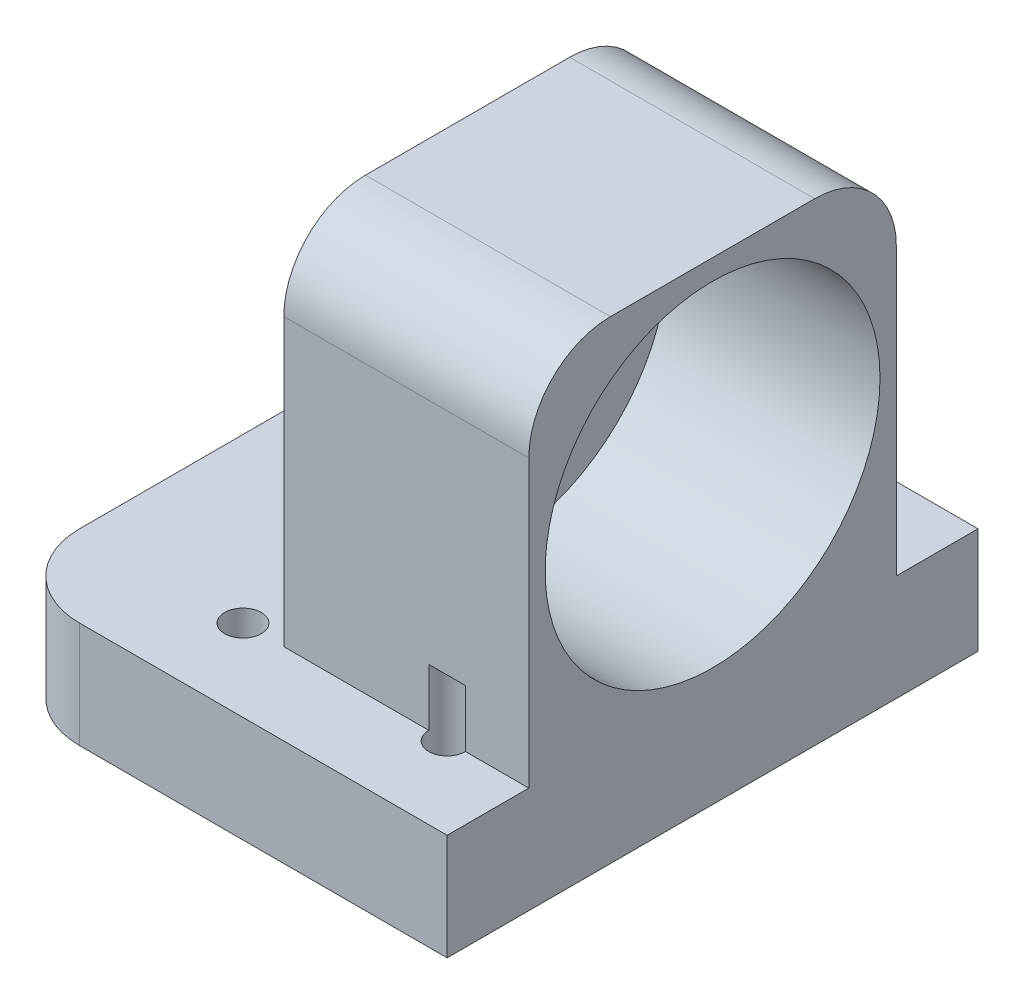
ISO-10303-21;
HEADER;
FILE_DESCRIPTION(('STEP AP214'),'2;1');
FILE_NAME('part.step','',(''),(''),'','','');
FILE_SCHEMA(('AUTOMOTIVE_DESIGN { 1 0 10303 214 1 1 1 1 }'));
ENDSEC;
DATA;
#1=APPLICATION_CONTEXT('core data for automotive mechanical design processes');
#2=APPLICATION_PROTOCOL_DEFINITION('international standard','automotive_design',2000,#1);
#3=PRODUCT_CONTEXT('',#1,'mechanical');
#4=PRODUCT('Part','Part','',(#3));
#5=PRODUCT_RELATED_PRODUCT_CATEGORY('part','',(#4));
#6=PRODUCT_DEFINITION_FORMATION('','',#4);
#7=PRODUCT_DEFINITION_CONTEXT('part definition',#1,'design');
#8=PRODUCT_DEFINITION('design','',#6,#7);
#9=PRODUCT_DEFINITION_SHAPE('','',#8);
#10=(LENGTH_UNIT() NAMED_UNIT(*) SI_UNIT(.MILLI.,.METRE.));
#11=(NAMED_UNIT(*) PLANE_ANGLE_UNIT() SI_UNIT($,.RADIAN.));
#12=(NAMED_UNIT(*) SI_UNIT($,.STERADIAN.) SOLID_ANGLE_UNIT());
#13=UNCERTAINTY_MEASURE_WITH_UNIT(LENGTH_MEASURE(1.E-05),#10,'distance_accuracy_value','');
#14=(GEOMETRIC_REPRESENTATION_CONTEXT(3) GLOBAL_UNCERTAINTY_ASSIGNED_CONTEXT((#13)) GLOBAL_UNIT_ASSIGNED_CONTEXT((#10,
#11,#12)) REPRESENTATION_CONTEXT('',''));
#15=CARTESIAN_POINT('',(0.,0.,0.));
#16=DIRECTION('',(0.,0.,1.));
#17=DIRECTION('',(1.,0.,0.));
#18=AXIS2_PLACEMENT_3D('',#15,#16,#17);
#19=CARTESIAN_POINT('',(22.5,13.,-32.5));
#20=DIRECTION('',(-1.,0.,0.));
#21=DIRECTION('',(0.,0.,1.));
#22=AXIS2_PLACEMENT_3D('',#19,#20,#21);
#23=PLANE('',#22);
#24=CARTESIAN_POINT('',(22.5,35.,0.));
#25=DIRECTION('',(1.,0.,0.));
#26=DIRECTION('',(0.,0.,-1.));
#27=AXIS2_PLACEMENT_3D('',#24,#25,#26);
#28=CIRCLE('',#27,20.5);
#29=CARTESIAN_POINT('',(22.5,35.,-20.5));
#30=VERTEX_POINT('',#29);
#31=EDGE_CURVE('E284',#30,#30,#28,.T.);
#32=ORIENTED_EDGE('',*,*,#31,.F.);
#33=EDGE_LOOP('',(#32));
#34=FACE_BOUND('',#33,.T.);
#35=DIRECTION('',(0.,-1.,0.));
#36=VECTOR('',#35,1.);
#37=CARTESIAN_POINT('',(22.5,63.,-22.5));
#38=LINE('',#37,#36);
#39=CARTESIAN_POINT('',(22.5,48.,-22.5));
#40=VERTEX_POINT('',#39);
#41=CARTESIAN_POINT('',(22.5,13.,-22.5));
#42=VERTEX_POINT('',#41);
#43=EDGE_CURVE('E308',#40,#42,#38,.T.);
#44=ORIENTED_EDGE('',*,*,#43,.F.);
#45=CARTESIAN_POINT('',(22.5,48.,-12.5));
#46=DIRECTION('',(-1.,0.,0.));
#47=DIRECTION('',(0.,0.,1.));
#48=AXIS2_PLACEMENT_3D('',#45,#46,#47);
#49=CIRCLE('',#48,10.);
#50=CARTESIAN_POINT('',(22.5,58.,-12.5));
#51=VERTEX_POINT('',#50);
#52=EDGE_CURVE('E11',#40,#51,#49,.F.);
#53=ORIENTED_EDGE('',*,*,#52,.T.);
#54=DIRECTION('',(0.,0.,-1.));
#55=VECTOR('',#54,1.);
#56=CARTESIAN_POINT('',(22.5,58.,-22.5));
#57=LINE('',#56,#55);
#58=CARTESIAN_POINT('',(22.5,58.,12.5));
#59=VERTEX_POINT('',#58);
#60=EDGE_CURVE('E168',#59,#51,#57,.T.);
#61=ORIENTED_EDGE('',*,*,#60,.F.);
#62=CARTESIAN_POINT('',(22.5,48.,12.5));
#63=DIRECTION('',(-1.,0.,0.));
#64=DIRECTION('',(0.,0.,1.));
#65=AXIS2_PLACEMENT_3D('',#62,#63,#64);
#66=CIRCLE('',#65,10.);
#67=CARTESIAN_POINT('',(22.5,48.,22.5));
#68=VERTEX_POINT('',#67);
#69=EDGE_CURVE('E209',#59,#68,#66,.F.);
#70=ORIENTED_EDGE('',*,*,#69,.T.);
#71=DIRECTION('',(0.,-1.,0.));
#72=VECTOR('',#71,1.);
#73=CARTESIAN_POINT('',(22.5,63.,22.5));
#74=LINE('',#73,#72);
#75=CARTESIAN_POINT('',(22.5,13.,22.5));
#76=VERTEX_POINT('',#75);
#77=EDGE_CURVE('E299',#68,#76,#74,.T.);
#78=ORIENTED_EDGE('',*,*,#77,.T.);
#79=DIRECTION('',(0.,0.,-1.));
#80=VECTOR('',#79,1.);
#81=CARTESIAN_POINT('',(22.5,13.,-32.5));
#82=LINE('',#81,#80);
#83=CARTESIAN_POINT('',(22.5,13.,32.5));
#84=VERTEX_POINT('',#83);
#85=EDGE_CURVE('E321',#84,#76,#82,.T.);
#86=ORIENTED_EDGE('',*,*,#85,.F.);
#87=DIRECTION('',(0.,-1.,0.));
#88=VECTOR('',#87,1.);
#89=CARTESIAN_POINT('',(22.5,13.,32.5));
#90=LINE('',#89,#88);
#91=CARTESIAN_POINT('',(22.5,0.,32.5));
#92=VERTEX_POINT('',#91);
#93=EDGE_CURVE('E160',#84,#92,#90,.T.);
#94=ORIENTED_EDGE('',*,*,#93,.T.);
#95=DIRECTION('',(0.,0.,-1.));
#96=VECTOR('',#95,1.);
#97=CARTESIAN_POINT('',(22.5,0.,-32.5));
#98=LINE('',#97,#96);
#99=CARTESIAN_POINT('',(22.5,0.,-32.5));
#100=VERTEX_POINT('',#99);
#101=EDGE_CURVE('E335',#92,#100,#98,.T.);
#102=ORIENTED_EDGE('',*,*,#101,.T.);
#103=DIRECTION('',(0.,-1.,0.));
#104=VECTOR('',#103,1.);
#105=CARTESIAN_POINT('',(22.5,13.,-32.5));
#106=LINE('',#105,#104);
#107=CARTESIAN_POINT('',(22.5,13.,-32.5));
#108=VERTEX_POINT('',#107);
#109=EDGE_CURVE('E343',#108,#100,#106,.T.);
#110=ORIENTED_EDGE('',*,*,#109,.F.);
#111=EDGE_CURVE('E320',#42,#108,#82,.T.);
#112=ORIENTED_EDGE('',*,*,#111,.F.);
#113=EDGE_LOOP('',(#44,#53,#61,#70,#78,#86,#94,#102,#110,#112));
#114=FACE_BOUND('',#113,.T.);
#115=ADVANCED_FACE('F45',(#34,#114),#23,.F.);
#116=CARTESIAN_POINT('',(22.5,63.,-22.5));
#117=DIRECTION('',(0.,0.,1.));
#118=DIRECTION('',(1.,0.,0.));
#119=AXIS2_PLACEMENT_3D('',#116,#117,#118);
#120=PLANE('',#119);
#121=DIRECTION('',(0.,-1.,0.));
#122=VECTOR('',#121,1.);
#123=CARTESIAN_POINT('',(-7.5,63.,-22.5));
#124=LINE('',#123,#122);
#125=CARTESIAN_POINT('',(-7.5,48.,-22.5));
#126=VERTEX_POINT('',#125);
#127=CARTESIAN_POINT('',(-7.5,13.,-22.5));
#128=VERTEX_POINT('',#127);
#129=EDGE_CURVE('E305',#126,#128,#124,.T.);
#130=ORIENTED_EDGE('',*,*,#129,.F.);
#131=DIRECTION('',(-1.,0.,0.));
#132=VECTOR('',#131,1.);
#133=CARTESIAN_POINT('',(22.5,48.,-22.5));
#134=LINE('',#133,#132);
#135=EDGE_CURVE('E54',#126,#40,#134,.F.);
#136=ORIENTED_EDGE('',*,*,#135,.T.);
#137=ORIENTED_EDGE('',*,*,#43,.T.);
#138=DIRECTION('',(-1.,0.,0.));
#139=VECTOR('',#138,1.);
#140=CARTESIAN_POINT('',(22.5,13.,-22.5));
#141=LINE('',#140,#139);
#142=CARTESIAN_POINT('',(14.75,13.,-22.5));
#143=VERTEX_POINT('',#142);
#144=EDGE_CURVE('E288',#42,#143,#141,.T.);
#145=ORIENTED_EDGE('',*,*,#144,.T.);
#146=DIRECTION('',(0.,-1.,0.));
#147=VECTOR('',#146,1.);
#148=CARTESIAN_POINT('',(14.75,20.,-22.5));
#149=LINE('',#148,#147);
#150=CARTESIAN_POINT('',(14.75,20.,-22.5));
#151=VERTEX_POINT('',#150);
#152=EDGE_CURVE('E184',#143,#151,#149,.F.);
#153=ORIENTED_EDGE('',*,*,#152,.T.);
#154=DIRECTION('',(1.,0.,0.));
#155=VECTOR('',#154,1.);
#156=CARTESIAN_POINT('',(22.5,20.,-22.5));
#157=LINE('',#156,#155);
#158=CARTESIAN_POINT('',(10.25,20.,-22.5));
#159=VERTEX_POINT('',#158);
#160=EDGE_CURVE('E178',#159,#151,#157,.T.);
#161=ORIENTED_EDGE('',*,*,#160,.F.);
#162=DIRECTION('',(0.,-1.,0.));
#163=VECTOR('',#162,1.);
#164=CARTESIAN_POINT('',(10.25,20.,-22.5));
#165=LINE('',#164,#163);
#166=CARTESIAN_POINT('',(10.25,13.,-22.5));
#167=VERTEX_POINT('',#166);
#168=EDGE_CURVE('E188',#159,#167,#165,.T.);
#169=ORIENTED_EDGE('',*,*,#168,.T.);
#170=EDGE_CURVE('E283',#167,#128,#141,.T.);
#171=ORIENTED_EDGE('',*,*,#170,.T.);
#172=EDGE_LOOP('',(#130,#136,#137,#145,#153,#161,#169,#171));
#173=FACE_BOUND('',#172,.T.);
#174=ADVANCED_FACE('F370',(#173),#120,.F.);
#175=CARTESIAN_POINT('',(-7.5,63.,-22.5));
#176=DIRECTION('',(1.,0.,0.));
#177=DIRECTION('',(0.,0.,-1.));
#178=AXIS2_PLACEMENT_3D('',#175,#176,#177);
#179=PLANE('',#178);
#180=CARTESIAN_POINT('',(-7.5,35.,0.));
#181=DIRECTION('',(1.,0.,0.));
#182=DIRECTION('',(0.,0.,-1.));
#183=AXIS2_PLACEMENT_3D('',#180,#181,#182);
#184=CIRCLE('',#183,7.);
#185=CARTESIAN_POINT('',(-7.5,35.,-7.));
#186=VERTEX_POINT('',#185);
#187=EDGE_CURVE('E278',#186,#186,#184,.T.);
#188=ORIENTED_EDGE('',*,*,#187,.T.);
#189=EDGE_LOOP('',(#188));
#190=FACE_BOUND('',#189,.T.);
#191=DIRECTION('',(0.,0.,1.));
#192=VECTOR('',#191,1.);
#193=CARTESIAN_POINT('',(-7.5,58.,-22.5));
#194=LINE('',#193,#192);
#195=CARTESIAN_POINT('',(-7.5,58.,-12.5));
#196=VERTEX_POINT('',#195);
#197=CARTESIAN_POINT('',(-7.5,58.,12.5));
#198=VERTEX_POINT('',#197);
#199=EDGE_CURVE('E229',#196,#198,#194,.T.);
#200=ORIENTED_EDGE('',*,*,#199,.F.);
#201=CARTESIAN_POINT('',(-7.5,48.,-12.5));
#202=DIRECTION('',(1.,0.,0.));
#203=DIRECTION('',(0.,0.,-1.));
#204=AXIS2_PLACEMENT_3D('',#201,#202,#203);
#205=CIRCLE('',#204,10.);
#206=EDGE_CURVE('E68',#196,#126,#205,.F.);
#207=ORIENTED_EDGE('',*,*,#206,.T.);
#208=ORIENTED_EDGE('',*,*,#129,.T.);
#209=DIRECTION('',(0.,0.,1.));
#210=VECTOR('',#209,1.);
#211=CARTESIAN_POINT('',(-7.5,13.,-22.5));
#212=LINE('',#211,#210);
#213=CARTESIAN_POINT('',(-7.49999999999999,13.,22.5));
#214=VERTEX_POINT('',#213);
#215=EDGE_CURVE('E292',#128,#214,#212,.T.);
#216=ORIENTED_EDGE('',*,*,#215,.T.);
#217=DIRECTION('',(0.,-1.,0.));
#218=VECTOR('',#217,1.);
#219=CARTESIAN_POINT('',(-7.49999999999999,63.,22.5));
#220=LINE('',#219,#218);
#221=CARTESIAN_POINT('',(-7.49999999999999,48.,22.5));
#222=VERTEX_POINT('',#221);
#223=EDGE_CURVE('E302',#222,#214,#220,.T.);
#224=ORIENTED_EDGE('',*,*,#223,.F.);
#225=CARTESIAN_POINT('',(-7.49999999999999,48.,12.5));
#226=DIRECTION('',(1.,0.,0.));
#227=DIRECTION('',(0.,0.,-1.));
#228=AXIS2_PLACEMENT_3D('',#225,#226,#227);
#229=CIRCLE('',#228,10.);
#230=EDGE_CURVE('E215',#222,#198,#229,.F.);
#231=ORIENTED_EDGE('',*,*,#230,.T.);
#232=EDGE_LOOP('',(#200,#207,#208,#216,#224,#231));
#233=FACE_BOUND('',#232,.T.);
#234=ADVANCED_FACE('F233',(#190,#233),#179,.F.);
#235=CARTESIAN_POINT('',(22.5,63.,22.5));
#236=DIRECTION('',(0.,0.,-1.));
#237=DIRECTION('',(-1.,0.,0.));
#238=AXIS2_PLACEMENT_3D('',#235,#236,#237);
#239=PLANE('',#238);
#240=ORIENTED_EDGE('',*,*,#77,.F.);
#241=DIRECTION('',(1.,0.,0.));
#242=VECTOR('',#241,1.);
#243=CARTESIAN_POINT('',(-7.49999999999999,48.,22.5));
#244=LINE('',#243,#242);
#245=EDGE_CURVE('E212',#68,#222,#244,.F.);
#246=ORIENTED_EDGE('',*,*,#245,.T.);
#247=ORIENTED_EDGE('',*,*,#223,.T.);
#248=DIRECTION('',(1.,0.,0.));
#249=VECTOR('',#248,1.);
#250=CARTESIAN_POINT('',(22.5,13.,22.5));
#251=LINE('',#250,#249);
#252=CARTESIAN_POINT('',(10.25,13.,22.5));
#253=VERTEX_POINT('',#252);
#254=EDGE_CURVE('E174',#214,#253,#251,.T.);
#255=ORIENTED_EDGE('',*,*,#254,.T.);
#256=DIRECTION('',(0.,-1.,0.));
#257=VECTOR('',#256,1.);
#258=CARTESIAN_POINT('',(10.25,20.,22.5));
#259=LINE('',#258,#257);
#260=CARTESIAN_POINT('',(10.25,20.,22.5));
#261=VERTEX_POINT('',#260);
#262=EDGE_CURVE('E159',#253,#261,#259,.F.);
#263=ORIENTED_EDGE('',*,*,#262,.T.);
#264=DIRECTION('',(-1.,0.,0.));
#265=VECTOR('',#264,1.);
#266=CARTESIAN_POINT('',(22.5,20.,22.5));
#267=LINE('',#266,#265);
#268=CARTESIAN_POINT('',(14.75,20.,22.5));
#269=VERTEX_POINT('',#268);
#270=EDGE_CURVE('E150',#269,#261,#267,.T.);
#271=ORIENTED_EDGE('',*,*,#270,.F.);
#272=DIRECTION('',(0.,-1.,0.));
#273=VECTOR('',#272,1.);
#274=CARTESIAN_POINT('',(14.75,20.,22.5));
#275=LINE('',#274,#273);
#276=CARTESIAN_POINT('',(14.75,13.,22.5));
#277=VERTEX_POINT('',#276);
#278=EDGE_CURVE('E165',#269,#277,#275,.T.);
#279=ORIENTED_EDGE('',*,*,#278,.T.);
#280=EDGE_CURVE('E296',#277,#76,#251,.T.);
#281=ORIENTED_EDGE('',*,*,#280,.T.);
#282=EDGE_LOOP('',(#240,#246,#247,#255,#263,#271,#279,#281));
#283=FACE_BOUND('',#282,.T.);
#284=ADVANCED_FACE('F172',(#283),#239,.F.);
#285=CARTESIAN_POINT('',(-32.5,13.,-32.5));
#286=DIRECTION('',(1.,0.,0.));
#287=DIRECTION('',(0.,0.,-1.));
#288=AXIS2_PLACEMENT_3D('',#285,#286,#287);
#289=PLANE('',#288);
#290=DIRECTION('',(0.,0.,1.));
#291=VECTOR('',#290,1.);
#292=CARTESIAN_POINT('',(-32.5,0.,-32.5));
#293=LINE('',#292,#291);
#294=CARTESIAN_POINT('',(-32.5,0.,-32.5));
#295=VERTEX_POINT('',#294);
#296=CARTESIAN_POINT('',(-32.5,0.,22.5));
#297=VERTEX_POINT('',#296);
#298=EDGE_CURVE('E311',#295,#297,#293,.T.);
#299=ORIENTED_EDGE('',*,*,#298,.T.);
#300=DIRECTION('',(0.,-1.,0.));
#301=VECTOR('',#300,1.);
#302=CARTESIAN_POINT('',(-32.5,13.,22.5));
#303=LINE('',#302,#301);
#304=CARTESIAN_POINT('',(-32.5,13.,22.5));
#305=VERTEX_POINT('',#304);
#306=EDGE_CURVE('E199',#297,#305,#303,.F.);
#307=ORIENTED_EDGE('',*,*,#306,.T.);
#308=DIRECTION('',(0.,0.,1.));
#309=VECTOR('',#308,1.);
#310=CARTESIAN_POINT('',(-32.5,13.,-32.5));
#311=LINE('',#310,#309);
#312=CARTESIAN_POINT('',(-32.5,13.,-32.5));
#313=VERTEX_POINT('',#312);
#314=EDGE_CURVE('E312',#313,#305,#311,.T.);
#315=ORIENTED_EDGE('',*,*,#314,.F.);
#316=DIRECTION('',(0.,-1.,0.));
#317=VECTOR('',#316,1.);
#318=CARTESIAN_POINT('',(-32.5,13.,-32.5));
#319=LINE('',#318,#317);
#320=EDGE_CURVE('E328',#313,#295,#319,.T.);
#321=ORIENTED_EDGE('',*,*,#320,.T.);
#322=EDGE_LOOP('',(#299,#307,#315,#321));
#323=FACE_BOUND('',#322,.T.);
#324=ADVANCED_FACE('F387',(#323),#289,.F.);
#325=CARTESIAN_POINT('',(-32.5,13.,32.5));
#326=DIRECTION('',(0.,0.,-1.));
#327=DIRECTION('',(-1.,0.,0.));
#328=AXIS2_PLACEMENT_3D('',#325,#326,#327);
#329=PLANE('',#328);
#330=DIRECTION('',(1.,0.,0.));
#331=VECTOR('',#330,1.);
#332=CARTESIAN_POINT('',(-32.5,13.,32.5));
#333=LINE('',#332,#331);
#334=CARTESIAN_POINT('',(-22.5,13.,32.5));
#335=VERTEX_POINT('',#334);
#336=EDGE_CURVE('E316',#335,#84,#333,.T.);
#337=ORIENTED_EDGE('',*,*,#336,.F.);
#338=DIRECTION('',(0.,-1.,0.));
#339=VECTOR('',#338,1.);
#340=CARTESIAN_POINT('',(-22.5,13.,32.5));
#341=LINE('',#340,#339);
#342=CARTESIAN_POINT('',(-22.5,0.,32.5));
#343=VERTEX_POINT('',#342);
#344=EDGE_CURVE('E192',#335,#343,#341,.T.);
#345=ORIENTED_EDGE('',*,*,#344,.T.);
#346=DIRECTION('',(1.,0.,0.));
#347=VECTOR('',#346,1.);
#348=CARTESIAN_POINT('',(-32.5,0.,32.5));
#349=LINE('',#348,#347);
#350=EDGE_CURVE('E332',#343,#92,#349,.T.);
#351=ORIENTED_EDGE('',*,*,#350,.T.);
#352=ORIENTED_EDGE('',*,*,#93,.F.);
#353=EDGE_LOOP('',(#337,#345,#351,#352));
#354=FACE_BOUND('',#353,.T.);
#355=ADVANCED_FACE('F384',(#354),#329,.F.);
#356=CARTESIAN_POINT('',(-32.5,13.,-32.5));
#357=DIRECTION('',(0.,0.,1.));
#358=DIRECTION('',(1.,0.,0.));
#359=AXIS2_PLACEMENT_3D('',#356,#357,#358);
#360=PLANE('',#359);
#361=DIRECTION('',(-1.,0.,0.));
#362=VECTOR('',#361,1.);
#363=CARTESIAN_POINT('',(-32.5,0.,-32.5));
#364=LINE('',#363,#362);
#365=EDGE_CURVE('E317',#100,#295,#364,.T.);
#366=ORIENTED_EDGE('',*,*,#365,.T.);
#367=ORIENTED_EDGE('',*,*,#320,.F.);
#368=DIRECTION('',(-1.,0.,0.));
#369=VECTOR('',#368,1.);
#370=CARTESIAN_POINT('',(-32.5,13.,-32.5));
#371=LINE('',#370,#369);
#372=EDGE_CURVE('E325',#108,#313,#371,.T.);
#373=ORIENTED_EDGE('',*,*,#372,.F.);
#374=ORIENTED_EDGE('',*,*,#109,.T.);
#375=EDGE_LOOP('',(#366,#367,#373,#374));
#376=FACE_BOUND('',#375,.T.);
#377=ADVANCED_FACE('F382',(#376),#360,.F.);
#378=CARTESIAN_POINT('',(0.,13.,0.));
#379=DIRECTION('',(0.,1.,0.));
#380=DIRECTION('',(0.,0.,1.));
#381=AXIS2_PLACEMENT_3D('',#378,#379,#380);
#382=PLANE('',#381);
#383=ORIENTED_EDGE('',*,*,#314,.T.);
#384=CARTESIAN_POINT('',(-22.5,13.,22.5));
#385=DIRECTION('',(0.,1.,0.));
#386=DIRECTION('',(0.,0.,1.));
#387=AXIS2_PLACEMENT_3D('',#384,#385,#386);
#388=CIRCLE('',#387,10.);
#389=EDGE_CURVE('E202',#305,#335,#388,.T.);
#390=ORIENTED_EDGE('',*,*,#389,.T.);
#391=ORIENTED_EDGE('',*,*,#336,.T.);
#392=ORIENTED_EDGE('',*,*,#85,.T.);
#393=ORIENTED_EDGE('',*,*,#280,.F.);
#394=CARTESIAN_POINT('',(12.5,13.,22.5));
#395=DIRECTION('',(0.,1.,0.));
#396=DIRECTION('',(0.,0.,1.));
#397=AXIS2_PLACEMENT_3D('',#394,#395,#396);
#398=CIRCLE('',#397,2.25);
#399=EDGE_CURVE('E260',#253,#277,#398,.T.);
#400=ORIENTED_EDGE('',*,*,#399,.F.);
#401=ORIENTED_EDGE('',*,*,#254,.F.);
#402=ORIENTED_EDGE('',*,*,#215,.F.);
#403=ORIENTED_EDGE('',*,*,#170,.F.);
#404=CARTESIAN_POINT('',(12.5,13.,-22.5));
#405=DIRECTION('',(0.,1.,0.));
#406=DIRECTION('',(0.,0.,1.));
#407=AXIS2_PLACEMENT_3D('',#404,#405,#406);
#408=CIRCLE('',#407,2.25);
#409=EDGE_CURVE('E263',#143,#167,#408,.T.);
#410=ORIENTED_EDGE('',*,*,#409,.F.);
#411=ORIENTED_EDGE('',*,*,#144,.F.);
#412=ORIENTED_EDGE('',*,*,#111,.T.);
#413=ORIENTED_EDGE('',*,*,#372,.T.);
#414=EDGE_LOOP('',(#383,#390,#391,#392,#393,#400,#401,#402,#403,#410,#411,#412,#413));
#415=FACE_BOUND('',#414,.T.);
#416=CARTESIAN_POINT('',(-12.5,13.,-22.5));
#417=DIRECTION('',(0.,1.,0.));
#418=DIRECTION('',(0.,0.,1.));
#419=AXIS2_PLACEMENT_3D('',#416,#417,#418);
#420=CIRCLE('',#419,2.25);
#421=CARTESIAN_POINT('',(-12.5,13.,-20.25));
#422=VERTEX_POINT('',#421);
#423=EDGE_CURVE('E270',#422,#422,#420,.T.);
#424=ORIENTED_EDGE('',*,*,#423,.F.);
#425=EDGE_LOOP('',(#424));
#426=FACE_BOUND('',#425,.T.);
#427=CARTESIAN_POINT('',(-12.5,13.,22.5));
#428=DIRECTION('',(0.,1.,0.));
#429=DIRECTION('',(0.,0.,1.));
#430=AXIS2_PLACEMENT_3D('',#427,#428,#429);
#431=CIRCLE('',#430,2.25);
#432=CARTESIAN_POINT('',(-12.5,13.,24.75));
#433=VERTEX_POINT('',#432);
#434=EDGE_CURVE('E266',#433,#433,#431,.T.);
#435=ORIENTED_EDGE('',*,*,#434,.F.);
#436=EDGE_LOOP('',(#435));
#437=FACE_BOUND('',#436,.T.);
#438=ADVANCED_FACE('F410',(#415,#426,#437),#382,.T.);
#439=CARTESIAN_POINT('',(0.,0.,0.));
#440=DIRECTION('',(0.,1.,0.));
#441=DIRECTION('',(0.,0.,1.));
#442=AXIS2_PLACEMENT_3D('',#439,#440,#441);
#443=PLANE('',#442);
#444=CARTESIAN_POINT('',(12.5,0.,22.5));
#445=DIRECTION('',(0.,-1.,0.));
#446=DIRECTION('',(0.,0.,-1.));
#447=AXIS2_PLACEMENT_3D('',#444,#445,#446);
#448=CIRCLE('',#447,2.25);
#449=CARTESIAN_POINT('',(12.5,0.,20.25));
#450=VERTEX_POINT('',#449);
#451=EDGE_CURVE('E167',#450,#450,#448,.T.);
#452=ORIENTED_EDGE('',*,*,#451,.F.);
#453=EDGE_LOOP('',(#452));
#454=FACE_BOUND('',#453,.T.);
#455=CARTESIAN_POINT('',(12.5,0.,-22.5));
#456=DIRECTION('',(0.,-1.,0.));
#457=DIRECTION('',(0.,0.,-1.));
#458=AXIS2_PLACEMENT_3D('',#455,#456,#457);
#459=CIRCLE('',#458,2.25);
#460=CARTESIAN_POINT('',(12.5,0.,-24.75));
#461=VERTEX_POINT('',#460);
#462=EDGE_CURVE('E247',#461,#461,#459,.T.);
#463=ORIENTED_EDGE('',*,*,#462,.F.);
#464=EDGE_LOOP('',(#463));
#465=FACE_BOUND('',#464,.T.);
#466=CARTESIAN_POINT('',(-12.5,0.,-22.5));
#467=DIRECTION('',(0.,-1.,0.));
#468=DIRECTION('',(0.,0.,-1.));
#469=AXIS2_PLACEMENT_3D('',#466,#467,#468);
#470=CIRCLE('',#469,2.25);
#471=CARTESIAN_POINT('',(-12.5,0.,-24.75));
#472=VERTEX_POINT('',#471);
#473=EDGE_CURVE('E242',#472,#472,#470,.T.);
#474=ORIENTED_EDGE('',*,*,#473,.F.);
#475=EDGE_LOOP('',(#474));
#476=FACE_BOUND('',#475,.T.);
#477=CARTESIAN_POINT('',(-12.5,0.,22.5));
#478=DIRECTION('',(0.,-1.,0.));
#479=DIRECTION('',(0.,0.,-1.));
#480=AXIS2_PLACEMENT_3D('',#477,#478,#479);
#481=CIRCLE('',#480,2.25);
#482=CARTESIAN_POINT('',(-12.5,0.,20.25));
#483=VERTEX_POINT('',#482);
#484=EDGE_CURVE('E246',#483,#483,#481,.T.);
#485=ORIENTED_EDGE('',*,*,#484,.F.);
#486=EDGE_LOOP('',(#485));
#487=FACE_BOUND('',#486,.T.);
#488=ORIENTED_EDGE('',*,*,#350,.F.);
#489=CARTESIAN_POINT('',(-22.5,0.,22.5));
#490=DIRECTION('',(0.,1.,0.));
#491=DIRECTION('',(0.,0.,1.));
#492=AXIS2_PLACEMENT_3D('',#489,#490,#491);
#493=CIRCLE('',#492,10.);
#494=EDGE_CURVE('E196',#343,#297,#493,.F.);
#495=ORIENTED_EDGE('',*,*,#494,.T.);
#496=ORIENTED_EDGE('',*,*,#298,.F.);
#497=ORIENTED_EDGE('',*,*,#365,.F.);
#498=ORIENTED_EDGE('',*,*,#101,.F.);
#499=EDGE_LOOP('',(#488,#495,#496,#497,#498));
#500=FACE_BOUND('',#499,.T.);
#501=ADVANCED_FACE('F519',(#454,#465,#476,#487,#500),#443,.F.);
#502=CARTESIAN_POINT('',(-3.5,35.,0.));
#503=DIRECTION('',(1.,0.,0.));
#504=DIRECTION('',(0.,0.,-1.));
#505=AXIS2_PLACEMENT_3D('',#502,#503,#504);
#506=CYLINDRICAL_SURFACE('',#505,20.5);
#507=CARTESIAN_POINT('',(-3.5,35.,0.));
#508=DIRECTION('',(1.,0.,0.));
#509=DIRECTION('',(0.,0.,-1.));
#510=AXIS2_PLACEMENT_3D('',#507,#508,#509);
#511=CIRCLE('',#510,20.5);
#512=CARTESIAN_POINT('',(-3.5,35.,-20.5));
#513=VERTEX_POINT('',#512);
#514=EDGE_CURVE('E279',#513,#513,#511,.T.);
#515=CARTESIAN_POINT('',(-3.5,35.,-20.5));
#516=CARTESIAN_POINT('',(-3.22916666666667,35.,-20.5));
#517=CARTESIAN_POINT('',(-2.95833333333333,35.,-20.5));
#518=CARTESIAN_POINT('',(-2.41666666666667,35.,-20.5));
#519=CARTESIAN_POINT('',(-2.14583333333333,35.,-20.5));
#520=CARTESIAN_POINT('',(-1.60416666666667,35.,-20.5));
#521=CARTESIAN_POINT('',(-1.33333333333333,35.,-20.5));
#522=CARTESIAN_POINT('',(-0.791666666666666,35.,-20.5));
#523=CARTESIAN_POINT('',(-0.520833333333333,35.,-20.5));
#524=CARTESIAN_POINT('',(0.0208333333333333,35.,-20.5));
#525=CARTESIAN_POINT('',(0.291666666666666,35.,-20.5));
#526=CARTESIAN_POINT('',(0.833333333333333,35.,-20.5));
#527=CARTESIAN_POINT('',(1.10416666666667,35.,-20.5));
#528=CARTESIAN_POINT('',(1.64583333333333,35.,-20.5));
#529=CARTESIAN_POINT('',(1.91666666666667,35.,-20.5));
#530=CARTESIAN_POINT('',(2.45833333333333,35.,-20.5));
#531=CARTESIAN_POINT('',(2.72916666666667,35.,-20.5));
#532=CARTESIAN_POINT('',(3.27083333333333,35.,-20.5));
#533=CARTESIAN_POINT('',(3.54166666666667,35.,-20.5));
#534=CARTESIAN_POINT('',(4.08333333333333,35.,-20.5));
#535=CARTESIAN_POINT('',(4.35416666666667,35.,-20.5));
#536=CARTESIAN_POINT('',(4.89583333333333,35.,-20.5));
#537=CARTESIAN_POINT('',(5.16666666666667,35.,-20.5));
#538=CARTESIAN_POINT('',(5.70833333333333,35.,-20.5));
#539=CARTESIAN_POINT('',(5.97916666666667,35.,-20.5));
#540=CARTESIAN_POINT('',(6.52083333333333,35.,-20.5));
#541=CARTESIAN_POINT('',(6.79166666666667,35.,-20.5));
#542=CARTESIAN_POINT('',(7.33333333333333,35.,-20.5));
#543=CARTESIAN_POINT('',(7.60416666666667,35.,-20.5));
#544=CARTESIAN_POINT('',(8.14583333333333,35.,-20.5));
#545=CARTESIAN_POINT('',(8.41666666666667,35.,-20.5));
#546=CARTESIAN_POINT('',(8.95833333333333,35.,-20.5));
#547=CARTESIAN_POINT('',(9.22916666666667,35.,-20.5));
#548=CARTESIAN_POINT('',(9.77083333333333,35.,-20.5));
#549=CARTESIAN_POINT('',(10.0416666666667,35.,-20.5));
#550=CARTESIAN_POINT('',(10.5833333333333,35.,-20.5));
#551=CARTESIAN_POINT('',(10.8541666666667,35.,-20.5));
#552=CARTESIAN_POINT('',(11.3958333333333,35.,-20.5));
#553=CARTESIAN_POINT('',(11.6666666666667,35.,-20.5));
#554=CARTESIAN_POINT('',(12.2083333333333,35.,-20.5));
#555=CARTESIAN_POINT('',(12.4791666666667,35.,-20.5));
#556=CARTESIAN_POINT('',(13.0208333333333,35.,-20.5));
#557=CARTESIAN_POINT('',(13.2916666666667,35.,-20.5));
#558=CARTESIAN_POINT('',(13.8333333333333,35.,-20.5));
#559=CARTESIAN_POINT('',(14.1041666666667,35.,-20.5));
#560=CARTESIAN_POINT('',(14.6458333333333,35.,-20.5));
#561=CARTESIAN_POINT('',(14.9166666666667,35.,-20.5));
#562=CARTESIAN_POINT('',(15.4583333333333,35.,-20.5));
#563=CARTESIAN_POINT('',(15.7291666666667,35.,-20.5));
#564=CARTESIAN_POINT('',(16.2708333333333,35.,-20.5));
#565=CARTESIAN_POINT('',(16.5416666666667,35.,-20.5));
#566=CARTESIAN_POINT('',(17.0833333333333,35.,-20.5));
#567=CARTESIAN_POINT('',(17.3541666666667,35.,-20.5));
#568=CARTESIAN_POINT('',(17.8958333333333,35.,-20.5));
#569=CARTESIAN_POINT('',(18.1666666666667,35.,-20.5));
#570=CARTESIAN_POINT('',(18.7083333333333,35.,-20.5));
#571=CARTESIAN_POINT('',(18.9791666666667,35.,-20.5));
#572=CARTESIAN_POINT('',(19.5208333333333,35.,-20.5));
#573=CARTESIAN_POINT('',(19.7916666666667,35.,-20.5));
#574=CARTESIAN_POINT('',(20.3333333333333,35.,-20.5));
#575=CARTESIAN_POINT('',(20.6041666666667,35.,-20.5));
#576=CARTESIAN_POINT('',(21.1458333333333,35.,-20.5));
#577=CARTESIAN_POINT('',(21.4166666666667,35.,-20.5));
#578=CARTESIAN_POINT('',(21.9583333333333,35.,-20.5));
#579=CARTESIAN_POINT('',(22.2291666666667,35.,-20.5));
#580=CARTESIAN_POINT('',(22.5,35.,-20.5));
#581=B_SPLINE_CURVE_WITH_KNOTS('',3,(#515,#516,#517,#518,#519,#520,#521,#522,#523,#524,#525,
#526,#527,#528,#529,#530,#531,#532,#533,#534,#535,#536,#537,#538,#539,#540,#541,#542,#543,#544,
#545,#546,#547,#548,#549,#550,#551,#552,#553,#554,#555,#556,#557,#558,#559,#560,#561,#562,#563,
#564,#565,#566,#567,#568,#569,#570,#571,#572,#573,#574,#575,#576,#577,#578,#579,#580),
.UNSPECIFIED.,.F.,.F.,(4,2,2,2,2,2,2,2,2,2,2,2,2,2,2,2,2,2,2,2,2,2,2,2,2,2,2,2,2,2,2,2,4),(0.,
0.8125,1.625,2.4375,3.25,4.0625,4.875,5.6875,6.5,7.3125,8.125,8.9375,9.75,10.5625,11.375,
12.1875,13.,13.8125,14.625,15.4375,16.25,17.0625,17.875,18.6875,19.5,20.3125,21.125,21.9375,
22.75,23.5625,24.375,25.1875,26.),.UNSPECIFIED.);
#582=EDGE_CURVE('BSEAM365',#513,#30,#581,.T.);
#583=ORIENTED_EDGE('',*,*,#514,.F.);
#584=ORIENTED_EDGE('',*,*,#31,.T.);
#585=ORIENTED_EDGE('',*,*,#582,.T.);
#586=ORIENTED_EDGE('',*,*,#582,.F.);
#587=EDGE_LOOP('',(#583,#585,#584,#586));
#588=FACE_BOUND('',#587,.T.);
#589=ADVANCED_FACE('F365',(#588),#506,.F.);
#590=CARTESIAN_POINT('',(-3.5,35.,0.));
#591=DIRECTION('',(1.,0.,0.));
#592=DIRECTION('',(0.,0.,-1.));
#593=AXIS2_PLACEMENT_3D('',#590,#591,#592);
#594=PLANE('',#593);
#595=CARTESIAN_POINT('',(-3.5,35.,0.));
#596=DIRECTION('',(1.,0.,0.));
#597=DIRECTION('',(0.,0.,-1.));
#598=AXIS2_PLACEMENT_3D('',#595,#596,#597);
#599=CIRCLE('',#598,7.);
#600=CARTESIAN_POINT('',(-3.5,35.,-7.));
#601=VERTEX_POINT('',#600);
#602=EDGE_CURVE('E274',#601,#601,#599,.T.);
#603=ORIENTED_EDGE('',*,*,#602,.F.);
#604=EDGE_LOOP('',(#603));
#605=FACE_BOUND('',#604,.T.);
#606=ORIENTED_EDGE('',*,*,#514,.T.);
#607=EDGE_LOOP('',(#606));
#608=FACE_BOUND('',#607,.T.);
#609=ADVANCED_FACE('F356',(#605,#608),#594,.T.);
#610=CARTESIAN_POINT('',(-23.5,35.,0.));
#611=DIRECTION('',(1.,0.,0.));
#612=DIRECTION('',(0.,0.,-1.));
#613=AXIS2_PLACEMENT_3D('',#610,#611,#612);
#614=CYLINDRICAL_SURFACE('',#613,7.);
#615=ORIENTED_EDGE('',*,*,#602,.T.);
#616=EDGE_LOOP('',(#615));
#617=FACE_BOUND('',#616,.T.);
#618=ORIENTED_EDGE('',*,*,#187,.F.);
#619=EDGE_LOOP('',(#618));
#620=FACE_BOUND('',#619,.T.);
#621=ADVANCED_FACE('F354',(#617,#620),#614,.F.);
#622=CARTESIAN_POINT('',(12.5,20.,22.5));
#623=DIRECTION('',(0.,-1.,0.));
#624=DIRECTION('',(0.,0.,-1.));
#625=AXIS2_PLACEMENT_3D('',#622,#623,#624);
#626=CYLINDRICAL_SURFACE('',#625,2.25);
#627=ORIENTED_EDGE('',*,*,#451,.T.);
#628=EDGE_LOOP('',(#627));
#629=FACE_BOUND('',#628,.T.);
#630=CARTESIAN_POINT('',(12.5,20.,22.5));
#631=DIRECTION('',(0.,-1.,0.));
#632=DIRECTION('',(0.,0.,-1.));
#633=AXIS2_PLACEMENT_3D('',#630,#631,#632);
#634=CIRCLE('',#633,2.25);
#635=EDGE_CURVE('E153',#261,#269,#634,.T.);
#636=ORIENTED_EDGE('',*,*,#635,.F.);
#637=ORIENTED_EDGE('',*,*,#262,.F.);
#638=ORIENTED_EDGE('',*,*,#399,.T.);
#639=ORIENTED_EDGE('',*,*,#278,.F.);
#640=EDGE_LOOP('',(#636,#637,#638,#639));
#641=FACE_BOUND('',#640,.T.);
#642=ADVANCED_FACE('F163',(#629,#641),#626,.F.);
#643=CARTESIAN_POINT('',(12.5,20.,22.5));
#644=DIRECTION('',(0.,-1.,0.));
#645=DIRECTION('',(0.,0.,-1.));
#646=AXIS2_PLACEMENT_3D('',#643,#644,#645);
#647=PLANE('',#646);
#648=ORIENTED_EDGE('',*,*,#270,.T.);
#649=ORIENTED_EDGE('',*,*,#635,.T.);
#650=EDGE_LOOP('',(#648,#649));
#651=FACE_BOUND('',#650,.T.);
#652=ADVANCED_FACE('F152',(#651),#647,.T.);
#653=CARTESIAN_POINT('',(12.5,20.,-22.5));
#654=DIRECTION('',(0.,-1.,0.));
#655=DIRECTION('',(0.,0.,-1.));
#656=AXIS2_PLACEMENT_3D('',#653,#654,#655);
#657=CYLINDRICAL_SURFACE('',#656,2.25);
#658=ORIENTED_EDGE('',*,*,#462,.T.);
#659=EDGE_LOOP('',(#658));
#660=FACE_BOUND('',#659,.T.);
#661=CARTESIAN_POINT('',(12.5,20.,-22.5));
#662=DIRECTION('',(0.,-1.,0.));
#663=DIRECTION('',(0.,0.,-1.));
#664=AXIS2_PLACEMENT_3D('',#661,#662,#663);
#665=CIRCLE('',#664,2.25);
#666=EDGE_CURVE('E251',#151,#159,#665,.T.);
#667=ORIENTED_EDGE('',*,*,#666,.F.);
#668=ORIENTED_EDGE('',*,*,#152,.F.);
#669=ORIENTED_EDGE('',*,*,#409,.T.);
#670=ORIENTED_EDGE('',*,*,#168,.F.);
#671=EDGE_LOOP('',(#667,#668,#669,#670));
#672=FACE_BOUND('',#671,.T.);
#673=ADVANCED_FACE('F418',(#660,#672),#657,.F.);
#674=CARTESIAN_POINT('',(12.5,20.,-22.5));
#675=DIRECTION('',(0.,-1.,0.));
#676=DIRECTION('',(0.,0.,-1.));
#677=AXIS2_PLACEMENT_3D('',#674,#675,#676);
#678=PLANE('',#677);
#679=ORIENTED_EDGE('',*,*,#160,.T.);
#680=ORIENTED_EDGE('',*,*,#666,.T.);
#681=EDGE_LOOP('',(#679,#680));
#682=FACE_BOUND('',#681,.T.);
#683=ADVANCED_FACE('F421',(#682),#678,.T.);
#684=CARTESIAN_POINT('',(-12.5,20.,22.5));
#685=DIRECTION('',(0.,-1.,0.));
#686=DIRECTION('',(0.,0.,-1.));
#687=AXIS2_PLACEMENT_3D('',#684,#685,#686);
#688=CYLINDRICAL_SURFACE('',#687,2.25);
#689=ORIENTED_EDGE('',*,*,#434,.T.);
#690=EDGE_LOOP('',(#689));
#691=FACE_BOUND('',#690,.T.);
#692=ORIENTED_EDGE('',*,*,#484,.T.);
#693=EDGE_LOOP('',(#692));
#694=FACE_BOUND('',#693,.T.);
#695=ADVANCED_FACE('F423',(#691,#694),#688,.F.);
#696=CARTESIAN_POINT('',(-12.5,20.,-22.5));
#697=DIRECTION('',(0.,-1.,0.));
#698=DIRECTION('',(0.,0.,-1.));
#699=AXIS2_PLACEMENT_3D('',#696,#697,#698);
#700=CYLINDRICAL_SURFACE('',#699,2.25);
#701=ORIENTED_EDGE('',*,*,#423,.T.);
#702=EDGE_LOOP('',(#701));
#703=FACE_BOUND('',#702,.T.);
#704=ORIENTED_EDGE('',*,*,#473,.T.);
#705=EDGE_LOOP('',(#704));
#706=FACE_BOUND('',#705,.T.);
#707=ADVANCED_FACE('F394',(#703,#706),#700,.F.);
#708=CARTESIAN_POINT('',(-22.5,13.,22.5));
#709=DIRECTION('',(0.,-1.,0.));
#710=DIRECTION('',(0.,0.,-1.));
#711=AXIS2_PLACEMENT_3D('',#708,#709,#710);
#712=CYLINDRICAL_SURFACE('',#711,10.);
#713=ORIENTED_EDGE('',*,*,#389,.F.);
#714=ORIENTED_EDGE('',*,*,#306,.F.);
#715=ORIENTED_EDGE('',*,*,#494,.F.);
#716=ORIENTED_EDGE('',*,*,#344,.F.);
#717=EDGE_LOOP('',(#713,#714,#715,#716));
#718=FACE_BOUND('',#717,.T.);
#719=ADVANCED_FACE('F392',(#718),#712,.T.);
#720=CARTESIAN_POINT('',(0.,58.,0.));
#721=DIRECTION('',(0.,1.,0.));
#722=DIRECTION('',(0.,0.,1.));
#723=AXIS2_PLACEMENT_3D('',#720,#721,#722);
#724=PLANE('',#723);
#725=ORIENTED_EDGE('',*,*,#60,.T.);
#726=DIRECTION('',(-1.,0.,0.));
#727=VECTOR('',#726,1.);
#728=CARTESIAN_POINT('',(-7.5,58.,-12.5));
#729=LINE('',#728,#727);
#730=EDGE_CURVE('E219',#51,#196,#729,.T.);
#731=ORIENTED_EDGE('',*,*,#730,.T.);
#732=ORIENTED_EDGE('',*,*,#199,.T.);
#733=DIRECTION('',(1.,0.,0.));
#734=VECTOR('',#733,1.);
#735=CARTESIAN_POINT('',(22.5,58.,12.5));
#736=LINE('',#735,#734);
#737=EDGE_CURVE('E205',#198,#59,#736,.T.);
#738=ORIENTED_EDGE('',*,*,#737,.T.);
#739=EDGE_LOOP('',(#725,#731,#732,#738));
#740=FACE_BOUND('',#739,.T.);
#741=ADVANCED_FACE('F228',(#740),#724,.T.);
#742=CARTESIAN_POINT('',(0.,48.,12.5));
#743=DIRECTION('',(-1.,0.,0.));
#744=DIRECTION('',(0.,0.,1.));
#745=AXIS2_PLACEMENT_3D('',#742,#743,#744);
#746=CYLINDRICAL_SURFACE('',#745,10.);
#747=ORIENTED_EDGE('',*,*,#230,.F.);
#748=ORIENTED_EDGE('',*,*,#245,.F.);
#749=ORIENTED_EDGE('',*,*,#69,.F.);
#750=ORIENTED_EDGE('',*,*,#737,.F.);
#751=EDGE_LOOP('',(#747,#748,#749,#750));
#752=FACE_BOUND('',#751,.T.);
#753=ADVANCED_FACE('F396',(#752),#746,.T.);
#754=CARTESIAN_POINT('',(0.,48.,-12.5));
#755=DIRECTION('',(1.,0.,0.));
#756=DIRECTION('',(0.,0.,-1.));
#757=AXIS2_PLACEMENT_3D('',#754,#755,#756);
#758=CYLINDRICAL_SURFACE('',#757,10.);
#759=ORIENTED_EDGE('',*,*,#52,.F.);
#760=ORIENTED_EDGE('',*,*,#135,.F.);
#761=ORIENTED_EDGE('',*,*,#206,.F.);
#762=ORIENTED_EDGE('',*,*,#730,.F.);
#763=EDGE_LOOP('',(#759,#760,#761,#762));
#764=FACE_BOUND('',#763,.T.);
#765=ADVANCED_FACE('F47',(#764),#758,.T.);
#766=CLOSED_SHELL('',(#115,#174,#234,#284,#324,#355,#377,#438,#501,#589,#609,#621,#642,#652,
#673,#683,#695,#707,#719,#741,#753,#765));
#767=MANIFOLD_SOLID_BREP('B2',#766);
#768=ADVANCED_BREP_SHAPE_REPRESENTATION('',(#18,#767),#14);
#769=SHAPE_DEFINITION_REPRESENTATION(#9,#768);
ENDSEC;
END-ISO-10303-21;
